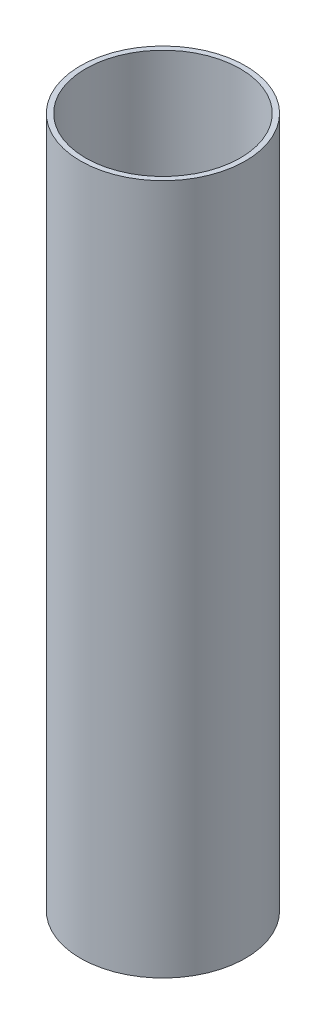
ISO-10303-21;
HEADER;
FILE_DESCRIPTION(('STEP AP214'),'2;1');
FILE_NAME('part.step','',(''),(''),'','','');
FILE_SCHEMA(('AUTOMOTIVE_DESIGN { 1 0 10303 214 1 1 1 1 }'));
ENDSEC;
DATA;
#1=APPLICATION_CONTEXT('core data for automotive mechanical design processes');
#2=APPLICATION_PROTOCOL_DEFINITION('international standard','automotive_design',2000,#1);
#3=PRODUCT_CONTEXT('',#1,'mechanical');
#4=PRODUCT('Part','Part','',(#3));
#5=PRODUCT_RELATED_PRODUCT_CATEGORY('part','',(#4));
#6=PRODUCT_DEFINITION_FORMATION('','',#4);
#7=PRODUCT_DEFINITION_CONTEXT('part definition',#1,'design');
#8=PRODUCT_DEFINITION('design','',#6,#7);
#9=PRODUCT_DEFINITION_SHAPE('','',#8);
#10=(LENGTH_UNIT() NAMED_UNIT(*) SI_UNIT(.MILLI.,.METRE.));
#11=(NAMED_UNIT(*) PLANE_ANGLE_UNIT() SI_UNIT($,.RADIAN.));
#12=(NAMED_UNIT(*) SI_UNIT($,.STERADIAN.) SOLID_ANGLE_UNIT());
#13=UNCERTAINTY_MEASURE_WITH_UNIT(LENGTH_MEASURE(1.E-05),#10,'distance_accuracy_value','');
#14=(GEOMETRIC_REPRESENTATION_CONTEXT(3) GLOBAL_UNCERTAINTY_ASSIGNED_CONTEXT((#13)) GLOBAL_UNIT_ASSIGNED_CONTEXT((#10,
#11,#12)) REPRESENTATION_CONTEXT('',''));
#15=CARTESIAN_POINT('',(0.,0.,0.));
#16=DIRECTION('',(0.,0.,1.));
#17=DIRECTION('',(1.,0.,0.));
#18=AXIS2_PLACEMENT_3D('',#15,#16,#17);
#19=CARTESIAN_POINT('',(0.,334.8,0.));
#20=DIRECTION('',(0.,1.,0.));
#21=DIRECTION('',(0.,0.,1.));
#22=AXIS2_PLACEMENT_3D('',#19,#20,#21);
#23=PLANE('',#22);
#24=CARTESIAN_POINT('',(0.,334.8,0.));
#25=DIRECTION('',(0.,1.,0.));
#26=DIRECTION('',(0.,0.,1.));
#27=AXIS2_PLACEMENT_3D('',#24,#25,#26);
#28=CIRCLE('',#27,40.);
#29=CARTESIAN_POINT('',(0.,334.8,40.));
#30=VERTEX_POINT('',#29);
#31=EDGE_CURVE('E10',#30,#30,#28,.T.);
#32=ORIENTED_EDGE('',*,*,#31,.T.);
#33=EDGE_LOOP('',(#32));
#34=FACE_BOUND('',#33,.T.);
#35=CARTESIAN_POINT('',(0.,334.8,0.));
#36=DIRECTION('',(0.,1.,0.));
#37=DIRECTION('',(0.,0.,1.));
#38=AXIS2_PLACEMENT_3D('',#35,#36,#37);
#39=CIRCLE('',#38,37.5);
#40=CARTESIAN_POINT('',(0.,334.8,37.5));
#41=VERTEX_POINT('',#40);
#42=EDGE_CURVE('E44',#41,#41,#39,.T.);
#43=ORIENTED_EDGE('',*,*,#42,.F.);
#44=EDGE_LOOP('',(#43));
#45=FACE_BOUND('',#44,.T.);
#46=ADVANCED_FACE('F33',(#34,#45),#23,.T.);
#47=CARTESIAN_POINT('',(0.,0.,0.));
#48=DIRECTION('',(0.,1.,0.));
#49=DIRECTION('',(0.,0.,1.));
#50=AXIS2_PLACEMENT_3D('',#47,#48,#49);
#51=PLANE('',#50);
#52=CARTESIAN_POINT('',(0.,0.,0.));
#53=DIRECTION('',(0.,1.,0.));
#54=DIRECTION('',(0.,0.,1.));
#55=AXIS2_PLACEMENT_3D('',#52,#53,#54);
#56=CIRCLE('',#55,40.);
#57=CARTESIAN_POINT('',(0.,0.,40.));
#58=VERTEX_POINT('',#57);
#59=EDGE_CURVE('E37',#58,#58,#56,.T.);
#60=ORIENTED_EDGE('',*,*,#59,.F.);
#61=EDGE_LOOP('',(#60));
#62=FACE_BOUND('',#61,.T.);
#63=CARTESIAN_POINT('',(0.,0.,0.));
#64=DIRECTION('',(0.,1.,0.));
#65=DIRECTION('',(0.,0.,1.));
#66=AXIS2_PLACEMENT_3D('',#63,#64,#65);
#67=CIRCLE('',#66,37.5);
#68=CARTESIAN_POINT('',(0.,0.,37.5));
#69=VERTEX_POINT('',#68);
#70=EDGE_CURVE('E46',#69,#69,#67,.T.);
#71=ORIENTED_EDGE('',*,*,#70,.T.);
#72=EDGE_LOOP('',(#71));
#73=FACE_BOUND('',#72,.T.);
#74=ADVANCED_FACE('F56',(#62,#73),#51,.F.);
#75=CARTESIAN_POINT('',(0.,334.8,0.));
#76=DIRECTION('',(0.,-1.,0.));
#77=DIRECTION('',(0.,0.,-1.));
#78=AXIS2_PLACEMENT_3D('',#75,#76,#77);
#79=CYLINDRICAL_SURFACE('',#78,40.);
#80=ORIENTED_EDGE('',*,*,#31,.F.);
#81=EDGE_LOOP('',(#80));
#82=FACE_BOUND('',#81,.T.);
#83=ORIENTED_EDGE('',*,*,#59,.T.);
#84=EDGE_LOOP('',(#83));
#85=FACE_BOUND('',#84,.T.);
#86=ADVANCED_FACE('F35',(#82,#85),#79,.T.);
#87=CARTESIAN_POINT('',(0.,334.8,0.));
#88=DIRECTION('',(0.,-1.,0.));
#89=DIRECTION('',(0.,0.,-1.));
#90=AXIS2_PLACEMENT_3D('',#87,#88,#89);
#91=CYLINDRICAL_SURFACE('',#90,37.5);
#92=ORIENTED_EDGE('',*,*,#42,.T.);
#93=EDGE_LOOP('',(#92));
#94=FACE_BOUND('',#93,.T.);
#95=ORIENTED_EDGE('',*,*,#70,.F.);
#96=EDGE_LOOP('',(#95));
#97=FACE_BOUND('',#96,.T.);
#98=ADVANCED_FACE('F52',(#94,#97),#91,.F.);
#99=CLOSED_SHELL('',(#46,#74,#86,#98));
#100=MANIFOLD_SOLID_BREP('B2',#99);
#101=ADVANCED_BREP_SHAPE_REPRESENTATION('',(#18,#100),#14);
#102=SHAPE_DEFINITION_REPRESENTATION(#9,#101);
ENDSEC;
END-ISO-10303-21;
